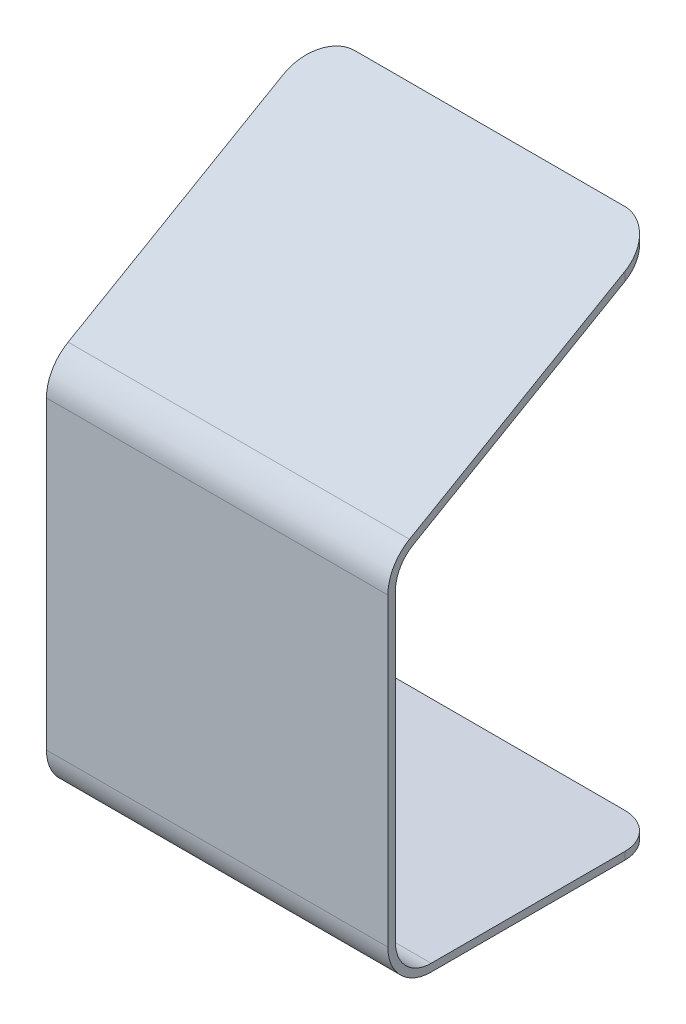
ISO-10303-21;
HEADER;
FILE_DESCRIPTION(('STEP AP214'),'2;1');
FILE_NAME('part.step','',(''),(''),'','','');
FILE_SCHEMA(('AUTOMOTIVE_DESIGN { 1 0 10303 214 1 1 1 1 }'));
ENDSEC;
DATA;
#1=APPLICATION_CONTEXT('core data for automotive mechanical design processes');
#2=APPLICATION_PROTOCOL_DEFINITION('international standard','automotive_design',2000,#1);
#3=PRODUCT_CONTEXT('',#1,'mechanical');
#4=PRODUCT('Part','Part','',(#3));
#5=PRODUCT_RELATED_PRODUCT_CATEGORY('part','',(#4));
#6=PRODUCT_DEFINITION_FORMATION('','',#4);
#7=PRODUCT_DEFINITION_CONTEXT('part definition',#1,'design');
#8=PRODUCT_DEFINITION('design','',#6,#7);
#9=PRODUCT_DEFINITION_SHAPE('','',#8);
#10=(LENGTH_UNIT() NAMED_UNIT(*) SI_UNIT(.MILLI.,.METRE.));
#11=(NAMED_UNIT(*) PLANE_ANGLE_UNIT() SI_UNIT($,.RADIAN.));
#12=(NAMED_UNIT(*) SI_UNIT($,.STERADIAN.) SOLID_ANGLE_UNIT());
#13=UNCERTAINTY_MEASURE_WITH_UNIT(LENGTH_MEASURE(1.E-05),#10,'distance_accuracy_value','');
#14=(GEOMETRIC_REPRESENTATION_CONTEXT(3) GLOBAL_UNCERTAINTY_ASSIGNED_CONTEXT((#13)) GLOBAL_UNIT_ASSIGNED_CONTEXT((#10,
#11,#12)) REPRESENTATION_CONTEXT('',''));
#15=CARTESIAN_POINT('',(0.,0.,0.));
#16=DIRECTION('',(0.,0.,1.));
#17=DIRECTION('',(1.,0.,0.));
#18=AXIS2_PLACEMENT_3D('',#15,#16,#17);
#19=CARTESIAN_POINT('',(61.5,105.01,8.5));
#20=DIRECTION('',(0.,-1.,0.));
#21=DIRECTION('',(0.,0.,-1.));
#22=AXIS2_PLACEMENT_3D('',#19,#20,#21);
#23=CYLINDRICAL_SURFACE('',#22,7.);
#24=DIRECTION('',(0.,-1.,0.));
#25=VECTOR('',#24,1.);
#26=CARTESIAN_POINT('',(61.5,105.01,1.5));
#27=LINE('',#26,#25);
#28=CARTESIAN_POINT('',(61.5,1.5,1.5));
#29=VERTEX_POINT('',#28);
#30=CARTESIAN_POINT('',(61.5,0.,1.5));
#31=VERTEX_POINT('',#30);
#32=EDGE_CURVE('E282',#29,#31,#27,.T.);
#33=ORIENTED_EDGE('',*,*,#32,.F.);
#34=CARTESIAN_POINT('',(61.5,1.5,8.5));
#35=DIRECTION('',(0.,1.,0.));
#36=DIRECTION('',(0.,0.,1.));
#37=AXIS2_PLACEMENT_3D('',#34,#35,#36);
#38=CIRCLE('',#37,7.);
#39=CARTESIAN_POINT('',(68.5,1.5,8.5));
#40=VERTEX_POINT('',#39);
#41=EDGE_CURVE('E195',#29,#40,#38,.F.);
#42=ORIENTED_EDGE('',*,*,#41,.T.);
#43=DIRECTION('',(0.,-1.,0.));
#44=VECTOR('',#43,1.);
#45=CARTESIAN_POINT('',(68.5,105.01,8.5));
#46=LINE('',#45,#44);
#47=CARTESIAN_POINT('',(68.5,0.,8.5));
#48=VERTEX_POINT('',#47);
#49=EDGE_CURVE('E279',#40,#48,#46,.T.);
#50=ORIENTED_EDGE('',*,*,#49,.T.);
#51=CARTESIAN_POINT('',(61.5,0.,8.5));
#52=DIRECTION('',(0.,1.,0.));
#53=DIRECTION('',(0.,0.,1.));
#54=AXIS2_PLACEMENT_3D('',#51,#52,#53);
#55=CIRCLE('',#54,7.);
#56=EDGE_CURVE('E242',#48,#31,#55,.T.);
#57=ORIENTED_EDGE('',*,*,#56,.T.);
#58=EDGE_LOOP('',(#33,#42,#50,#57));
#59=FACE_BOUND('',#58,.T.);
#60=ADVANCED_FACE('F32',(#59),#23,.T.);
#61=CARTESIAN_POINT('',(61.5,104.133974596216,1.5));
#62=VERTEX_POINT('',#61);
#63=CARTESIAN_POINT('',(61.5,102.401923788647,1.5));
#64=VERTEX_POINT('',#63);
#65=EDGE_CURVE('E281',#62,#64,#27,.T.);
#66=ORIENTED_EDGE('',*,*,#65,.F.);
#67=CARTESIAN_POINT('',(61.5,100.092522711888,8.5));
#68=DIRECTION('',(0.,-0.866025403784436,-0.500000000000004));
#69=DIRECTION('',(0.,-0.500000000000004,0.866025403784436));
#70=AXIS2_PLACEMENT_3D('',#67,#68,#69);
#71=ELLIPSE('',#70,8.08290376865478,7.);
#72=CARTESIAN_POINT('',(68.5,100.092522711888,8.5));
#73=VERTEX_POINT('',#72);
#74=EDGE_CURVE('E228',#62,#73,#71,.T.);
#75=ORIENTED_EDGE('',*,*,#74,.T.);
#76=CARTESIAN_POINT('',(68.5,98.3604719043192,8.5));
#77=VERTEX_POINT('',#76);
#78=EDGE_CURVE('E175',#73,#77,#46,.T.);
#79=ORIENTED_EDGE('',*,*,#78,.T.);
#80=CARTESIAN_POINT('',(61.5,98.3604719043192,8.5));
#81=DIRECTION('',(0.,-0.866025403784436,-0.500000000000004));
#82=DIRECTION('',(0.,-0.500000000000004,0.866025403784436));
#83=AXIS2_PLACEMENT_3D('',#80,#81,#82);
#84=ELLIPSE('',#83,8.08290376865478,7.);
#85=EDGE_CURVE('E201',#77,#64,#84,.F.);
#86=ORIENTED_EDGE('',*,*,#85,.T.);
#87=EDGE_LOOP('',(#66,#75,#79,#86));
#88=FACE_BOUND('',#87,.T.);
#89=ADVANCED_FACE('F351',(#88),#23,.T.);
#90=CARTESIAN_POINT('',(8.5,105.01,8.5));
#91=DIRECTION('',(0.,-1.,0.));
#92=DIRECTION('',(0.,0.,-1.));
#93=AXIS2_PLACEMENT_3D('',#90,#91,#92);
#94=CYLINDRICAL_SURFACE('',#93,7.);
#95=DIRECTION('',(0.,-1.,0.));
#96=VECTOR('',#95,1.);
#97=CARTESIAN_POINT('',(1.5,105.01,8.5));
#98=LINE('',#97,#96);
#99=CARTESIAN_POINT('',(1.5,1.5,8.5));
#100=VERTEX_POINT('',#99);
#101=CARTESIAN_POINT('',(1.5,0.,8.5));
#102=VERTEX_POINT('',#101);
#103=EDGE_CURVE('E11',#100,#102,#98,.T.);
#104=ORIENTED_EDGE('',*,*,#103,.F.);
#105=CARTESIAN_POINT('',(8.5,1.5,8.5));
#106=DIRECTION('',(0.,1.,0.));
#107=DIRECTION('',(0.,0.,1.));
#108=AXIS2_PLACEMENT_3D('',#105,#106,#107);
#109=CIRCLE('',#108,7.);
#110=CARTESIAN_POINT('',(8.5,1.5,1.5));
#111=VERTEX_POINT('',#110);
#112=EDGE_CURVE('E192',#100,#111,#109,.F.);
#113=ORIENTED_EDGE('',*,*,#112,.T.);
#114=DIRECTION('',(0.,-1.,0.));
#115=VECTOR('',#114,1.);
#116=CARTESIAN_POINT('',(8.5,105.01,1.5));
#117=LINE('',#116,#115);
#118=CARTESIAN_POINT('',(8.5,0.,1.5));
#119=VERTEX_POINT('',#118);
#120=EDGE_CURVE('E285',#111,#119,#117,.T.);
#121=ORIENTED_EDGE('',*,*,#120,.T.);
#122=CARTESIAN_POINT('',(8.5,0.,8.5));
#123=DIRECTION('',(0.,1.,0.));
#124=DIRECTION('',(0.,0.,1.));
#125=AXIS2_PLACEMENT_3D('',#122,#123,#124);
#126=CIRCLE('',#125,7.);
#127=EDGE_CURVE('E236',#119,#102,#126,.T.);
#128=ORIENTED_EDGE('',*,*,#127,.T.);
#129=EDGE_LOOP('',(#104,#113,#121,#128));
#130=FACE_BOUND('',#129,.T.);
#131=ADVANCED_FACE('F329',(#130),#94,.T.);
#132=CARTESIAN_POINT('',(1.5,100.092522711888,8.5));
#133=VERTEX_POINT('',#132);
#134=CARTESIAN_POINT('',(1.5,98.3604719043192,8.5));
#135=VERTEX_POINT('',#134);
#136=EDGE_CURVE('E41',#133,#135,#98,.T.);
#137=ORIENTED_EDGE('',*,*,#136,.F.);
#138=CARTESIAN_POINT('',(8.5,100.092522711888,8.5));
#139=DIRECTION('',(0.,-0.866025403784436,-0.500000000000004));
#140=DIRECTION('',(0.,-0.500000000000004,0.866025403784436));
#141=AXIS2_PLACEMENT_3D('',#138,#139,#140);
#142=ELLIPSE('',#141,8.08290376865478,7.);
#143=CARTESIAN_POINT('',(8.5,104.133974596216,1.5));
#144=VERTEX_POINT('',#143);
#145=EDGE_CURVE('E222',#133,#144,#142,.T.);
#146=ORIENTED_EDGE('',*,*,#145,.T.);
#147=CARTESIAN_POINT('',(8.5,102.401923788647,1.5));
#148=VERTEX_POINT('',#147);
#149=EDGE_CURVE('E284',#144,#148,#117,.T.);
#150=ORIENTED_EDGE('',*,*,#149,.T.);
#151=CARTESIAN_POINT('',(8.5,98.3604719043192,8.5));
#152=DIRECTION('',(0.,-0.866025403784436,-0.500000000000004));
#153=DIRECTION('',(0.,0.500000000000004,-0.866025403784436));
#154=AXIS2_PLACEMENT_3D('',#151,#152,#153);
#155=ELLIPSE('',#154,8.08290376865478,7.);
#156=EDGE_CURVE('E207',#148,#135,#155,.F.);
#157=ORIENTED_EDGE('',*,*,#156,.T.);
#158=EDGE_LOOP('',(#137,#146,#150,#157));
#159=FACE_BOUND('',#158,.T.);
#160=ADVANCED_FACE('F384',(#159),#94,.T.);
#161=CARTESIAN_POINT('',(1.5,105.01,66.7307479045185));
#162=DIRECTION('',(-1.,0.,0.));
#163=DIRECTION('',(0.,0.,1.));
#164=AXIS2_PLACEMENT_3D('',#161,#162,#163);
#165=PLANE('',#164);
#166=CARTESIAN_POINT('',(1.5,8.5,46.5));
#167=DIRECTION('',(-1.,0.,0.));
#168=DIRECTION('',(0.,0.,1.));
#169=AXIS2_PLACEMENT_3D('',#166,#167,#168);
#170=CIRCLE('',#169,8.5);
#171=CARTESIAN_POINT('',(1.5,8.49999999999999,55.));
#172=VERTEX_POINT('',#171);
#173=CARTESIAN_POINT('',(1.5,0.,46.5));
#174=VERTEX_POINT('',#173);
#175=EDGE_CURVE('E172',#172,#174,#170,.F.);
#176=ORIENTED_EDGE('',*,*,#175,.F.);
#177=DIRECTION('',(0.,1.,0.));
#178=VECTOR('',#177,1.);
#179=CARTESIAN_POINT('',(1.5,73.2457351945702,55.));
#180=LINE('',#179,#178);
#181=CARTESIAN_POINT('',(1.5,68.3382579064584,55.));
#182=VERTEX_POINT('',#181);
#183=EDGE_CURVE('E213',#172,#182,#180,.T.);
#184=ORIENTED_EDGE('',*,*,#183,.T.);
#185=CARTESIAN_POINT('',(1.5,68.3382579064584,46.5));
#186=DIRECTION('',(-1.,0.,0.));
#187=DIRECTION('',(0.,0.,1.));
#188=AXIS2_PLACEMENT_3D('',#185,#186,#187);
#189=CIRCLE('',#188,8.5);
#190=CARTESIAN_POINT('',(1.5,75.6994738386261,50.75));
#191=VERTEX_POINT('',#190);
#192=EDGE_CURVE('E253',#191,#182,#189,.F.);
#193=ORIENTED_EDGE('',*,*,#192,.F.);
#194=DIRECTION('',(0.,0.500000000000004,-0.866025403784436));
#195=VECTOR('',#194,1.);
#196=CARTESIAN_POINT('',(1.5,105.,0.));
#197=LINE('',#196,#195);
#198=EDGE_CURVE('E219',#191,#133,#197,.T.);
#199=ORIENTED_EDGE('',*,*,#198,.T.);
#200=ORIENTED_EDGE('',*,*,#136,.T.);
#201=DIRECTION('',(0.,-0.500000000000004,0.866025403784436));
#202=VECTOR('',#201,1.);
#203=CARTESIAN_POINT('',(1.5,103.700961894323,-0.750000000000007));
#204=LINE('',#203,#202);
#205=CARTESIAN_POINT('',(1.5,74.4004357329495,50.));
#206=VERTEX_POINT('',#205);
#207=EDGE_CURVE('E198',#135,#206,#204,.T.);
#208=ORIENTED_EDGE('',*,*,#207,.T.);
#209=CARTESIAN_POINT('',(1.5,68.3382579064584,46.5));
#210=DIRECTION('',(1.,0.,0.));
#211=DIRECTION('',(0.,0.,-1.));
#212=AXIS2_PLACEMENT_3D('',#209,#210,#211);
#213=CIRCLE('',#212,7.);
#214=CARTESIAN_POINT('',(1.5,68.3382579064584,53.5));
#215=VERTEX_POINT('',#214);
#216=EDGE_CURVE('E255',#215,#206,#213,.F.);
#217=ORIENTED_EDGE('',*,*,#216,.F.);
#218=DIRECTION('',(0.,-1.,0.));
#219=VECTOR('',#218,1.);
#220=CARTESIAN_POINT('',(1.5,73.2457351945702,53.5));
#221=LINE('',#220,#219);
#222=CARTESIAN_POINT('',(1.5,8.49999999999999,53.5));
#223=VERTEX_POINT('',#222);
#224=EDGE_CURVE('E210',#215,#223,#221,.T.);
#225=ORIENTED_EDGE('',*,*,#224,.T.);
#226=CARTESIAN_POINT('',(1.5,8.5,46.5));
#227=DIRECTION('',(1.,0.,0.));
#228=DIRECTION('',(0.,0.,-1.));
#229=AXIS2_PLACEMENT_3D('',#226,#227,#228);
#230=CIRCLE('',#229,7.);
#231=CARTESIAN_POINT('',(1.5,1.5,46.5));
#232=VERTEX_POINT('',#231);
#233=EDGE_CURVE('E258',#232,#223,#230,.F.);
#234=ORIENTED_EDGE('',*,*,#233,.F.);
#235=DIRECTION('',(0.,0.,-1.));
#236=VECTOR('',#235,1.);
#237=CARTESIAN_POINT('',(1.5,1.5,55.));
#238=LINE('',#237,#236);
#239=EDGE_CURVE('E189',#232,#100,#238,.T.);
#240=ORIENTED_EDGE('',*,*,#239,.T.);
#241=ORIENTED_EDGE('',*,*,#103,.T.);
#242=DIRECTION('',(0.,0.,1.));
#243=VECTOR('',#242,1.);
#244=CARTESIAN_POINT('',(1.5,0.,55.));
#245=LINE('',#244,#243);
#246=EDGE_CURVE('E234',#102,#174,#245,.T.);
#247=ORIENTED_EDGE('',*,*,#246,.T.);
#248=EDGE_LOOP('',(#176,#184,#193,#199,#200,#208,#217,#225,#234,#240,#241,#247));
#249=FACE_BOUND('',#248,.T.);
#250=ADVANCED_FACE('F332',(#249),#165,.T.);
#251=CARTESIAN_POINT('',(8.5,105.01,1.5));
#252=DIRECTION('',(0.,0.,-1.));
#253=DIRECTION('',(-1.,0.,0.));
#254=AXIS2_PLACEMENT_3D('',#251,#252,#253);
#255=PLANE('',#254);
#256=ORIENTED_EDGE('',*,*,#149,.F.);
#257=DIRECTION('',(1.,0.,0.));
#258=VECTOR('',#257,1.);
#259=CARTESIAN_POINT('',(70.,104.133974596216,1.5));
#260=LINE('',#259,#258);
#261=EDGE_CURVE('E225',#144,#62,#260,.T.);
#262=ORIENTED_EDGE('',*,*,#261,.T.);
#263=ORIENTED_EDGE('',*,*,#65,.T.);
#264=DIRECTION('',(-1.,0.,0.));
#265=VECTOR('',#264,1.);
#266=CARTESIAN_POINT('',(70.,102.401923788647,1.5));
#267=LINE('',#266,#265);
#268=EDGE_CURVE('E204',#64,#148,#267,.T.);
#269=ORIENTED_EDGE('',*,*,#268,.T.);
#270=EDGE_LOOP('',(#256,#262,#263,#269));
#271=FACE_BOUND('',#270,.T.);
#272=ADVANCED_FACE('F366',(#271),#255,.T.);
#273=DIRECTION('',(-1.,0.,0.));
#274=VECTOR('',#273,1.);
#275=CARTESIAN_POINT('',(70.,1.5,1.5));
#276=LINE('',#275,#274);
#277=EDGE_CURVE('E274',#29,#111,#276,.T.);
#278=ORIENTED_EDGE('',*,*,#277,.F.);
#279=ORIENTED_EDGE('',*,*,#32,.T.);
#280=DIRECTION('',(-1.,0.,0.));
#281=VECTOR('',#280,1.);
#282=CARTESIAN_POINT('',(70.,0.,1.5));
#283=LINE('',#282,#281);
#284=EDGE_CURVE('E239',#31,#119,#283,.T.);
#285=ORIENTED_EDGE('',*,*,#284,.T.);
#286=ORIENTED_EDGE('',*,*,#120,.F.);
#287=EDGE_LOOP('',(#278,#279,#285,#286));
#288=FACE_BOUND('',#287,.T.);
#289=ADVANCED_FACE('F325',(#288),#255,.T.);
#290=CARTESIAN_POINT('',(68.5,105.01,8.5));
#291=DIRECTION('',(1.,0.,0.));
#292=DIRECTION('',(0.,0.,-1.));
#293=AXIS2_PLACEMENT_3D('',#290,#291,#292);
#294=PLANE('',#293);
#295=CARTESIAN_POINT('',(68.5,8.5,46.5));
#296=DIRECTION('',(1.,0.,0.));
#297=DIRECTION('',(0.,0.,-1.));
#298=AXIS2_PLACEMENT_3D('',#295,#296,#297);
#299=CIRCLE('',#298,8.5);
#300=CARTESIAN_POINT('',(68.5,0.,46.5));
#301=VERTEX_POINT('',#300);
#302=CARTESIAN_POINT('',(68.5,8.49999999999999,55.));
#303=VERTEX_POINT('',#302);
#304=EDGE_CURVE('E248',#301,#303,#299,.F.);
#305=ORIENTED_EDGE('',*,*,#304,.F.);
#306=DIRECTION('',(0.,0.,-1.));
#307=VECTOR('',#306,1.);
#308=CARTESIAN_POINT('',(68.5,0.,55.));
#309=LINE('',#308,#307);
#310=EDGE_CURVE('E245',#301,#48,#309,.T.);
#311=ORIENTED_EDGE('',*,*,#310,.T.);
#312=ORIENTED_EDGE('',*,*,#49,.F.);
#313=DIRECTION('',(0.,0.,-1.));
#314=VECTOR('',#313,1.);
#315=CARTESIAN_POINT('',(68.5,1.5,55.));
#316=LINE('',#315,#314);
#317=CARTESIAN_POINT('',(68.5,1.5,46.5));
#318=VERTEX_POINT('',#317);
#319=EDGE_CURVE('E266',#318,#40,#316,.T.);
#320=ORIENTED_EDGE('',*,*,#319,.F.);
#321=CARTESIAN_POINT('',(68.5,8.5,46.5));
#322=DIRECTION('',(1.,0.,0.));
#323=DIRECTION('',(0.,0.,-1.));
#324=AXIS2_PLACEMENT_3D('',#321,#322,#323);
#325=CIRCLE('',#324,7.);
#326=CARTESIAN_POINT('',(68.5,8.49999999999999,53.5));
#327=VERTEX_POINT('',#326);
#328=EDGE_CURVE('E269',#327,#318,#325,.T.);
#329=ORIENTED_EDGE('',*,*,#328,.F.);
#330=DIRECTION('',(0.,-1.,0.));
#331=VECTOR('',#330,1.);
#332=CARTESIAN_POINT('',(68.5,73.2457351945702,53.5));
#333=LINE('',#332,#331);
#334=CARTESIAN_POINT('',(68.5,68.3382579064584,53.5));
#335=VERTEX_POINT('',#334);
#336=EDGE_CURVE('E271',#335,#327,#333,.T.);
#337=ORIENTED_EDGE('',*,*,#336,.F.);
#338=CARTESIAN_POINT('',(68.5,68.3382579064584,46.5));
#339=DIRECTION('',(1.,0.,0.));
#340=DIRECTION('',(0.,0.,-1.));
#341=AXIS2_PLACEMENT_3D('',#338,#339,#340);
#342=CIRCLE('',#341,7.);
#343=CARTESIAN_POINT('',(68.5,74.4004357329495,50.));
#344=VERTEX_POINT('',#343);
#345=EDGE_CURVE('E261',#344,#335,#342,.T.);
#346=ORIENTED_EDGE('',*,*,#345,.F.);
#347=DIRECTION('',(0.,-0.500000000000004,0.866025403784436));
#348=VECTOR('',#347,1.);
#349=CARTESIAN_POINT('',(68.5,103.700961894323,-0.750000000000007));
#350=LINE('',#349,#348);
#351=EDGE_CURVE('E264',#77,#344,#350,.T.);
#352=ORIENTED_EDGE('',*,*,#351,.F.);
#353=ORIENTED_EDGE('',*,*,#78,.F.);
#354=DIRECTION('',(0.,-0.500000000000004,0.866025403784436));
#355=VECTOR('',#354,1.);
#356=CARTESIAN_POINT('',(68.5,105.,0.));
#357=LINE('',#356,#355);
#358=CARTESIAN_POINT('',(68.5,75.6994738386261,50.75));
#359=VERTEX_POINT('',#358);
#360=EDGE_CURVE('E231',#73,#359,#357,.T.);
#361=ORIENTED_EDGE('',*,*,#360,.T.);
#362=CARTESIAN_POINT('',(68.5,68.3382579064584,46.5));
#363=DIRECTION('',(1.,0.,0.));
#364=DIRECTION('',(0.,0.,-1.));
#365=AXIS2_PLACEMENT_3D('',#362,#363,#364);
#366=CIRCLE('',#365,8.5);
#367=CARTESIAN_POINT('',(68.5,68.3382579064584,55.));
#368=VERTEX_POINT('',#367);
#369=EDGE_CURVE('E251',#368,#359,#366,.F.);
#370=ORIENTED_EDGE('',*,*,#369,.F.);
#371=DIRECTION('',(0.,-1.,0.));
#372=VECTOR('',#371,1.);
#373=CARTESIAN_POINT('',(68.5,73.2457351945702,55.));
#374=LINE('',#373,#372);
#375=EDGE_CURVE('E216',#368,#303,#374,.T.);
#376=ORIENTED_EDGE('',*,*,#375,.T.);
#377=EDGE_LOOP('',(#305,#311,#312,#320,#329,#337,#346,#352,#353,#361,#370,#376));
#378=FACE_BOUND('',#377,.T.);
#379=ADVANCED_FACE('F319',(#378),#294,.T.);
#380=CARTESIAN_POINT('',(70.,73.2457351945702,53.5));
#381=DIRECTION('',(0.,0.,-1.));
#382=DIRECTION('',(0.,1.,0.));
#383=AXIS2_PLACEMENT_3D('',#380,#381,#382);
#384=PLANE('',#383);
#385=ORIENTED_EDGE('',*,*,#224,.F.);
#386=DIRECTION('',(1.,0.,0.));
#387=VECTOR('',#386,1.);
#388=CARTESIAN_POINT('',(70.,68.3382579064584,53.5));
#389=LINE('',#388,#387);
#390=EDGE_CURVE('E273',#335,#215,#389,.F.);
#391=ORIENTED_EDGE('',*,*,#390,.F.);
#392=ORIENTED_EDGE('',*,*,#336,.T.);
#393=DIRECTION('',(1.,0.,0.));
#394=VECTOR('',#393,1.);
#395=CARTESIAN_POINT('',(70.,8.49999999999999,53.5));
#396=LINE('',#395,#394);
#397=EDGE_CURVE('E288',#223,#327,#396,.T.);
#398=ORIENTED_EDGE('',*,*,#397,.F.);
#399=EDGE_LOOP('',(#385,#391,#392,#398));
#400=FACE_BOUND('',#399,.T.);
#401=ADVANCED_FACE('F337',(#400),#384,.T.);
#402=CARTESIAN_POINT('',(70.,68.3382579064584,46.5));
#403=DIRECTION('',(-1.,0.,0.));
#404=DIRECTION('',(0.,0.,1.));
#405=AXIS2_PLACEMENT_3D('',#402,#403,#404);
#406=CYLINDRICAL_SURFACE('',#405,7.);
#407=ORIENTED_EDGE('',*,*,#345,.T.);
#408=ORIENTED_EDGE('',*,*,#390,.T.);
#409=ORIENTED_EDGE('',*,*,#216,.T.);
#410=DIRECTION('',(1.,0.,0.));
#411=VECTOR('',#410,1.);
#412=CARTESIAN_POINT('',(70.,74.4004357329495,50.));
#413=LINE('',#412,#411);
#414=EDGE_CURVE('E278',#206,#344,#413,.T.);
#415=ORIENTED_EDGE('',*,*,#414,.T.);
#416=EDGE_LOOP('',(#407,#408,#409,#415));
#417=FACE_BOUND('',#416,.T.);
#418=ADVANCED_FACE('F341',(#417),#406,.F.);
#419=CARTESIAN_POINT('',(70.,103.700961894323,-0.750000000000007));
#420=DIRECTION('',(0.,-0.866025403784436,-0.500000000000004));
#421=DIRECTION('',(0.,0.500000000000004,-0.866025403784436));
#422=AXIS2_PLACEMENT_3D('',#419,#420,#421);
#423=PLANE('',#422);
#424=ORIENTED_EDGE('',*,*,#207,.F.);
#425=ORIENTED_EDGE('',*,*,#156,.F.);
#426=ORIENTED_EDGE('',*,*,#268,.F.);
#427=ORIENTED_EDGE('',*,*,#85,.F.);
#428=ORIENTED_EDGE('',*,*,#351,.T.);
#429=ORIENTED_EDGE('',*,*,#414,.F.);
#430=EDGE_LOOP('',(#424,#425,#426,#427,#428,#429));
#431=FACE_BOUND('',#430,.T.);
#432=ADVANCED_FACE('F344',(#431),#423,.T.);
#433=CARTESIAN_POINT('',(70.,8.5,46.5));
#434=DIRECTION('',(-1.,0.,0.));
#435=DIRECTION('',(0.,0.,1.));
#436=AXIS2_PLACEMENT_3D('',#433,#434,#435);
#437=CYLINDRICAL_SURFACE('',#436,7.);
#438=DIRECTION('',(1.,0.,0.));
#439=VECTOR('',#438,1.);
#440=CARTESIAN_POINT('',(70.,1.5,46.5));
#441=LINE('',#440,#439);
#442=CARTESIAN_POINT('',(40.5312182202479,1.5,46.5));
#443=VERTEX_POINT('',#442);
#444=EDGE_CURVE('E188',#318,#443,#441,.F.);
#445=ORIENTED_EDGE('',*,*,#444,.T.);
#446=CARTESIAN_POINT('',(29.4687817797526,1.5,46.5));
#447=CARTESIAN_POINT('',(29.5301118335923,1.49997470016608,46.6459837601903));
#448=CARTESIAN_POINT('',(29.5972452807778,1.50456530663728,46.7894444680259));
#449=CARTESIAN_POINT('',(29.7423143634233,1.52184552435535,47.0700937770729));
#450=CARTESIAN_POINT('',(29.8202376857949,1.5345259623978,47.2072892939239));
#451=CARTESIAN_POINT('',(29.9856577824779,1.56674776836113,47.4736058736147));
#452=CARTESIAN_POINT('',(30.0730856098583,1.58624173405357,47.6027756413585));
#453=CARTESIAN_POINT('',(30.2571808960842,1.63088076856255,47.8532959998036));
#454=CARTESIAN_POINT('',(30.3538508368553,1.65602735782783,47.9746444754042));
#455=CARTESIAN_POINT('',(30.6558545126004,1.73787163193586,48.3250686648718));
#456=CARTESIAN_POINT('',(30.8740146998385,1.80115773839708,48.54185350332));
#457=CARTESIAN_POINT('',(31.2229674474469,1.90168119662235,48.8395003934864));
#458=CARTESIAN_POINT('',(31.3431093230496,1.93617991700726,48.9342545053146));
#459=CARTESIAN_POINT('',(31.5901522686312,2.00577702702049,49.1142612712932));
#460=CARTESIAN_POINT('',(31.7170539149063,2.04087546760342,49.1995131134169));
#461=CARTESIAN_POINT('',(32.1351595765042,2.1526002503018,49.4577152237021));
#462=CARTESIAN_POINT('',(32.4389860947111,2.22797020819354,49.6116423452689));
#463=CARTESIAN_POINT('',(32.9128385410771,2.32778322101689,49.8028641523064));
#464=CARTESIAN_POINT('',(33.073813805818,2.35884805320336,49.8599945192775));
#465=CARTESIAN_POINT('',(33.4009997373706,2.41493547074396,49.9605355692925));
#466=CARTESIAN_POINT('',(33.5672072671495,2.43996160147571,50.0039543072075));
#467=CARTESIAN_POINT('',(33.8984272186687,2.48182717388239,50.0753687476534));
#468=CARTESIAN_POINT('',(34.0633162361681,2.49889688149909,50.1038018533352));
#469=CARTESIAN_POINT('',(34.3955373788374,2.52494172459454,50.1468228286306));
#470=CARTESIAN_POINT('',(34.5628694107167,2.53391716834925,50.1614112255311));
#471=CARTESIAN_POINT('',(34.8983008123948,2.54319413130898,50.176485273935));
#472=CARTESIAN_POINT('',(35.0663996113153,2.54350129717984,50.1769801062315));
#473=CARTESIAN_POINT('',(35.4018257359008,2.53543544922339,50.1638816236283));
#474=CARTESIAN_POINT('',(35.5691531198947,2.52706310286008,50.1502893920393));
#475=CARTESIAN_POINT('',(35.8793963945288,2.50383350858317,50.1119814268931));
#476=CARTESIAN_POINT('',(36.022604177402,2.48998467190602,50.0889818653959));
#477=CARTESIAN_POINT('',(36.3063928030092,2.45681394525266,50.0328392799027));
#478=CARTESIAN_POINT('',(36.4469727776756,2.43749027963276,49.999692964743));
#479=CARTESIAN_POINT('',(36.8635555742569,2.37251772448071,49.8855156577538));
#480=CARTESIAN_POINT('',(37.134537826672,2.31985573719314,49.7897290694134));
#481=CARTESIAN_POINT('',(37.6778465761082,2.19939560639297,49.5530610745705));
#482=CARTESIAN_POINT('',(37.9487341433393,2.1307556416222,49.4093243070525));
#483=CARTESIAN_POINT('',(38.3360238570941,2.02630261857822,49.164423100178));
#484=CARTESIAN_POINT('',(38.4620563892969,1.99120237501183,49.0778113828557));
#485=CARTESIAN_POINT('',(38.7073301380954,1.9217649381766,48.8950726348188));
#486=CARTESIAN_POINT('',(38.8265699898637,1.8874278990948,48.7989437023959));
#487=CARTESIAN_POINT('',(39.0724626759913,1.81654405354974,48.584641852606));
#488=CARTESIAN_POINT('',(39.1981124144731,1.78027649997942,48.4652220969029));
#489=CARTESIAN_POINT('',(39.4391234457731,1.71218817937507,48.2153335092484));
#490=CARTESIAN_POINT('',(39.554489353178,1.68036541419327,48.0848696847809));
#491=CARTESIAN_POINT('',(39.7737425323597,1.62302659075819,47.8139110186491));
#492=CARTESIAN_POINT('',(39.8776596889457,1.59749388696536,47.6734439484195));
#493=CARTESIAN_POINT('',(40.0732683713339,1.55439329300806,47.3831968498862));
#494=CARTESIAN_POINT('',(40.164970083179,1.53681873709681,47.233424735528));
#495=CARTESIAN_POINT('',(40.3019835260846,1.51624075430047,46.9857799462951));
#496=CARTESIAN_POINT('',(40.3514467816795,1.51022792810372,46.8904280645694));
#497=CARTESIAN_POINT('',(40.4452326968096,1.5021057383745,46.6971011460833));
#498=CARTESIAN_POINT('',(40.4895567365325,1.49999532452375,46.5991268223465));
#499=CARTESIAN_POINT('',(40.5312182202479,1.5,46.5));
#500=B_SPLINE_CURVE_WITH_KNOTS('',3,(#446,#447,#448,#449,#450,#451,#452,#453,#454,#455,#456,
#457,#458,#459,#460,#461,#462,#463,#464,#465,#466,#467,#468,#469,#470,#471,#472,#473,#474,#475,
#476,#477,#478,#479,#480,#481,#482,#483,#484,#485,#486,#487,#488,#489,#490,#491,#492,#493,#494,
#495,#496,#497,#498,#499),.UNSPECIFIED.,.F.,.F.,(4,2,2,2,2,2,2,2,2,2,2,2,2,2,2,2,2,2,2,2,2,2,2,
2,2,2,4),(0.,0.474722070848745,0.948906800306641,1.4198561816956,1.89093239145707,
2.82839963876045,3.2986104326184,3.7688613780916,4.80938623269992,5.32968336813614,
5.84967428495937,6.35350403721282,6.85731459993119,7.36079696417146,7.86424061293848,
8.30085221223051,8.73760557957755,9.61070269904374,10.5496248981546,11.0199717318588,
11.490412739618,12.0210362307881,12.5514204078891,13.0803855644179,13.6089068363056,
13.9314576678152,14.2539216734492),.UNSPECIFIED.);
#501=CARTESIAN_POINT('',(29.4687817797526,1.5,46.5));
#502=VERTEX_POINT('',#501);
#503=EDGE_CURVE('E48',#502,#443,#500,.T.);
#504=ORIENTED_EDGE('',*,*,#503,.F.);
#505=EDGE_CURVE('E277',#502,#232,#441,.F.);
#506=ORIENTED_EDGE('',*,*,#505,.T.);
#507=ORIENTED_EDGE('',*,*,#233,.T.);
#508=ORIENTED_EDGE('',*,*,#397,.T.);
#509=ORIENTED_EDGE('',*,*,#328,.T.);
#510=EDGE_LOOP('',(#445,#504,#506,#507,#508,#509));
#511=FACE_BOUND('',#510,.T.);
#512=ADVANCED_FACE('F315',(#511),#437,.F.);
#513=CARTESIAN_POINT('',(70.,1.5,55.));
#514=DIRECTION('',(0.,1.,0.));
#515=DIRECTION('',(0.,0.,1.));
#516=AXIS2_PLACEMENT_3D('',#513,#514,#515);
#517=PLANE('',#516);
#518=CARTESIAN_POINT('',(35.0000000000003,1.5,44.1749999999999));
#519=DIRECTION('',(0.,1.,0.));
#520=DIRECTION('',(0.,0.,1.));
#521=AXIS2_PLACEMENT_3D('',#518,#519,#520);
#522=CIRCLE('',#521,6.);
#523=EDGE_CURVE('E161',#502,#443,#522,.F.);
#524=ORIENTED_EDGE('',*,*,#523,.T.);
#525=ORIENTED_EDGE('',*,*,#444,.F.);
#526=ORIENTED_EDGE('',*,*,#319,.T.);
#527=ORIENTED_EDGE('',*,*,#41,.F.);
#528=ORIENTED_EDGE('',*,*,#277,.T.);
#529=ORIENTED_EDGE('',*,*,#112,.F.);
#530=ORIENTED_EDGE('',*,*,#239,.F.);
#531=ORIENTED_EDGE('',*,*,#505,.F.);
#532=EDGE_LOOP('',(#524,#525,#526,#527,#528,#529,#530,#531));
#533=FACE_BOUND('',#532,.T.);
#534=ADVANCED_FACE('F312',(#533),#517,.T.);
#535=CARTESIAN_POINT('',(70.,105.,0.));
#536=DIRECTION('',(0.,-0.866025403784436,-0.500000000000004));
#537=DIRECTION('',(0.,0.500000000000004,-0.866025403784436));
#538=AXIS2_PLACEMENT_3D('',#535,#536,#537);
#539=PLANE('',#538);
#540=ORIENTED_EDGE('',*,*,#360,.F.);
#541=ORIENTED_EDGE('',*,*,#74,.F.);
#542=ORIENTED_EDGE('',*,*,#261,.F.);
#543=ORIENTED_EDGE('',*,*,#145,.F.);
#544=ORIENTED_EDGE('',*,*,#198,.F.);
#545=DIRECTION('',(-1.,0.,0.));
#546=VECTOR('',#545,1.);
#547=CARTESIAN_POINT('',(70.,75.6994738386261,50.75));
#548=LINE('',#547,#546);
#549=EDGE_CURVE('E183',#191,#359,#548,.F.);
#550=ORIENTED_EDGE('',*,*,#549,.T.);
#551=EDGE_LOOP('',(#540,#541,#542,#543,#544,#550));
#552=FACE_BOUND('',#551,.T.);
#553=ADVANCED_FACE('F34',(#552),#539,.F.);
#554=CARTESIAN_POINT('',(70.,73.2457351945702,55.));
#555=DIRECTION('',(0.,0.,-1.));
#556=DIRECTION('',(0.,1.,0.));
#557=AXIS2_PLACEMENT_3D('',#554,#555,#556);
#558=PLANE('',#557);
#559=ORIENTED_EDGE('',*,*,#375,.F.);
#560=DIRECTION('',(-1.,0.,0.));
#561=VECTOR('',#560,1.);
#562=CARTESIAN_POINT('',(70.,68.3382579064584,55.));
#563=LINE('',#562,#561);
#564=EDGE_CURVE('E174',#368,#182,#563,.T.);
#565=ORIENTED_EDGE('',*,*,#564,.T.);
#566=ORIENTED_EDGE('',*,*,#183,.F.);
#567=DIRECTION('',(-1.,0.,0.));
#568=VECTOR('',#567,1.);
#569=CARTESIAN_POINT('',(70.,8.49999999999999,55.));
#570=LINE('',#569,#568);
#571=EDGE_CURVE('E177',#172,#303,#570,.F.);
#572=ORIENTED_EDGE('',*,*,#571,.T.);
#573=EDGE_LOOP('',(#559,#565,#566,#572));
#574=FACE_BOUND('',#573,.T.);
#575=ADVANCED_FACE('F359',(#574),#558,.F.);
#576=CARTESIAN_POINT('',(70.,68.3382579064584,46.5));
#577=DIRECTION('',(-1.,0.,0.));
#578=DIRECTION('',(0.,0.,1.));
#579=AXIS2_PLACEMENT_3D('',#576,#577,#578);
#580=CYLINDRICAL_SURFACE('',#579,8.5);
#581=ORIENTED_EDGE('',*,*,#564,.F.);
#582=ORIENTED_EDGE('',*,*,#369,.T.);
#583=ORIENTED_EDGE('',*,*,#549,.F.);
#584=ORIENTED_EDGE('',*,*,#192,.T.);
#585=EDGE_LOOP('',(#581,#582,#583,#584));
#586=FACE_BOUND('',#585,.T.);
#587=ADVANCED_FACE('F358',(#586),#580,.T.);
#588=CARTESIAN_POINT('',(70.,0.,55.));
#589=DIRECTION('',(0.,1.,0.));
#590=DIRECTION('',(0.,0.,1.));
#591=AXIS2_PLACEMENT_3D('',#588,#589,#590);
#592=PLANE('',#591);
#593=DIRECTION('',(-1.,0.,0.));
#594=VECTOR('',#593,1.);
#595=CARTESIAN_POINT('',(70.,0.,46.5));
#596=LINE('',#595,#594);
#597=CARTESIAN_POINT('',(40.5312182202479,0.,46.5));
#598=VERTEX_POINT('',#597);
#599=EDGE_CURVE('E36',#301,#598,#596,.T.);
#600=ORIENTED_EDGE('',*,*,#599,.T.);
#601=CARTESIAN_POINT('',(35.0000000000003,0.,44.1749999999999));
#602=DIRECTION('',(0.,-1.,0.));
#603=DIRECTION('',(0.,0.,-1.));
#604=AXIS2_PLACEMENT_3D('',#601,#602,#603);
#605=CIRCLE('',#604,6.);
#606=CARTESIAN_POINT('',(29.4687817797526,0.,46.5));
#607=VERTEX_POINT('',#606);
#608=EDGE_CURVE('E55',#607,#598,#605,.T.);
#609=ORIENTED_EDGE('',*,*,#608,.F.);
#610=EDGE_CURVE('E166',#607,#174,#596,.T.);
#611=ORIENTED_EDGE('',*,*,#610,.T.);
#612=ORIENTED_EDGE('',*,*,#246,.F.);
#613=ORIENTED_EDGE('',*,*,#127,.F.);
#614=ORIENTED_EDGE('',*,*,#284,.F.);
#615=ORIENTED_EDGE('',*,*,#56,.F.);
#616=ORIENTED_EDGE('',*,*,#310,.F.);
#617=EDGE_LOOP('',(#600,#609,#611,#612,#613,#614,#615,#616));
#618=FACE_BOUND('',#617,.T.);
#619=ADVANCED_FACE('F164',(#618),#592,.F.);
#620=CARTESIAN_POINT('',(70.,8.5,46.5));
#621=DIRECTION('',(-1.,0.,0.));
#622=DIRECTION('',(0.,0.,1.));
#623=AXIS2_PLACEMENT_3D('',#620,#621,#622);
#624=CYLINDRICAL_SURFACE('',#623,8.5);
#625=CARTESIAN_POINT('',(29.4687817797526,0.,46.5));
#626=CARTESIAN_POINT('',(29.5313760879534,-2.43986574831991E-05,46.6489858062534));
#627=CARTESIAN_POINT('',(29.600018571255,0.00391589790983806,46.7953704714911));
#628=CARTESIAN_POINT('',(29.7486465047364,0.0187268491540125,47.0817503442479));
#629=CARTESIAN_POINT('',(29.8286223533929,0.0295916644164786,47.2217508290242));
#630=CARTESIAN_POINT('',(29.9988530510757,0.0571881075694948,47.4937612216967));
#631=CARTESIAN_POINT('',(30.089055579302,0.0738907091379191,47.6258069420354));
#632=CARTESIAN_POINT('',(30.2793435412272,0.11207995430463,47.8818647812101));
#633=CARTESIAN_POINT('',(30.3794309029934,0.133567532256954,48.0058753249172));
#634=CARTESIAN_POINT('',(30.5884310795294,0.1801151027378,48.244788131527));
#635=CARTESIAN_POINT('',(30.6973152642079,0.205163692948391,48.3597177112392));
#636=CARTESIAN_POINT('',(30.9235385334417,0.257739515506125,48.5803875805141));
#637=CARTESIAN_POINT('',(31.0408805243797,0.285267600708962,48.6861246834353));
#638=CARTESIAN_POINT('',(31.2835088921736,0.341671519587494,48.8880285151673));
#639=CARTESIAN_POINT('',(31.4088062219339,0.370549196292128,48.9841815594848));
#640=CARTESIAN_POINT('',(31.6665697138007,0.428448838530285,49.1663072838767));
#641=CARTESIAN_POINT('',(31.799036321831,0.457470812936827,49.2522793296376));
#642=CARTESIAN_POINT('',(32.0807185668226,0.516644615311489,49.4196749622288));
#643=CARTESIAN_POINT('',(32.2304445611676,0.546717220998335,49.5002699684744));
#644=CARTESIAN_POINT('',(32.5365505692893,0.604265152994504,49.6486031227349));
#645=CARTESIAN_POINT('',(32.6929281217258,0.631741428130717,49.7163459767505));
#646=CARTESIAN_POINT('',(33.0113660192919,0.682756775905788,49.838425827638));
#647=CARTESIAN_POINT('',(33.1734232289323,0.706297980764339,49.892770092174));
#648=CARTESIAN_POINT('',(33.5022029354214,0.748251174334396,49.9875611520608));
#649=CARTESIAN_POINT('',(33.6689251035965,0.766663523407328,50.0280089238476));
#650=CARTESIAN_POINT('',(34.000444521756,0.796877962812749,50.0934901986403));
#651=CARTESIAN_POINT('',(34.1651359296061,0.808870669986813,50.1189706827628));
#652=CARTESIAN_POINT('',(34.4964102243519,0.826475221574015,50.1561515934323));
#653=CARTESIAN_POINT('',(34.6629930690223,0.832087208151765,50.1678523269972));
#654=CARTESIAN_POINT('',(34.9965907559196,0.836622258973002,50.177318235787));
#655=CARTESIAN_POINT('',(35.1636054379859,0.835547523295173,50.1750879946081));
#656=CARTESIAN_POINT('',(35.4966872357469,0.826772938435146,50.1567321336191));
#657=CARTESIAN_POINT('',(35.6627543927812,0.819073380546603,50.1406071247623));
#658=CARTESIAN_POINT('',(35.9790385583825,0.79835716072887,50.0965582593061));
#659=CARTESIAN_POINT('',(36.1294391571507,0.785827976150905,50.0697096808206));
#660=CARTESIAN_POINT('',(36.4273628067069,0.756095315199998,50.0047418509847));
#661=CARTESIAN_POINT('',(36.5748848611879,0.738890250148284,49.9666187686161));
#662=CARTESIAN_POINT('',(36.8661188727191,0.700537644456004,49.879445484177));
#663=CARTESIAN_POINT('',(37.0098312640238,0.679390555383808,49.8303965335658));
#664=CARTESIAN_POINT('',(37.2927270969383,0.634009061032104,49.7217457422431));
#665=CARTESIAN_POINT('',(37.4319088434919,0.609773516558878,49.6621400044242));
#666=CARTESIAN_POINT('',(37.856636773663,0.531038134751911,49.4609427122368));
#667=CARTESIAN_POINT('',(38.133353145306,0.472777834362927,49.301727877188));
#668=CARTESIAN_POINT('',(38.6583281544623,0.355948431943942,48.9413538103964));
#669=CARTESIAN_POINT('',(38.9065557421739,0.297379064409037,48.7401494748843));
#670=CARTESIAN_POINT('',(39.2621408945084,0.214529011656032,48.4015515963804));
#671=CARTESIAN_POINT('',(39.3816618874239,0.186893858290052,48.2775347131285));
#672=CARTESIAN_POINT('',(39.6099596319155,0.135831841737787,48.0192094303731));
#673=CARTESIAN_POINT('',(39.7187412349431,0.112403074391306,47.8849057270204));
#674=CARTESIAN_POINT('',(39.9244074764358,0.0712535047901034,47.6072006195406));
#675=CARTESIAN_POINT('',(40.0213217718039,0.0535182862685146,47.4638233111455));
#676=CARTESIAN_POINT('',(40.2026106279544,0.0250580150881892,47.1687881167755));
#677=CARTESIAN_POINT('',(40.2869958132356,0.0143269964401634,47.0171373975058));
#678=CARTESIAN_POINT('',(40.3944369638748,0.00518070745624148,46.8026361837267));
#679=CARTESIAN_POINT('',(40.4232054630613,0.00325186794014253,46.742734794254));
#680=CARTESIAN_POINT('',(40.4787251517681,0.000662008095963149,46.6220342809124));
#681=CARTESIAN_POINT('',(40.5054779000833,-1.75049711152572E-09,46.5612358951256));
#682=CARTESIAN_POINT('',(40.5312182202479,0.,46.5));
#683=B_SPLINE_CURVE_WITH_KNOTS('',3,(#625,#626,#627,#628,#629,#630,#631,#632,#633,#634,#635,
#636,#637,#638,#639,#640,#641,#642,#643,#644,#645,#646,#647,#648,#649,#650,#651,#652,#653,#654,
#655,#656,#657,#658,#659,#660,#661,#662,#663,#664,#665,#666,#667,#668,#669,#670,#671,#672,#673,
#674,#675,#676,#677,#678,#679,#680,#681,#682),.UNSPECIFIED.,.F.,.F.,(4,2,2,2,2,2,2,2,2,2,2,2,2,
2,2,2,2,2,2,2,2,2,2,2,2,2,2,2,4),(0.,0.484541405290136,0.968674738754176,1.45043435383475,
1.93228812389849,2.41263237248564,2.89314247753317,3.3743291304162,3.85554574723001,
4.37295979473183,4.89018401641511,5.4071270649933,5.92403378317801,6.42459500199365,
6.92514506791755,7.42553045057247,7.92589383238964,8.38525000401904,8.84476244219699,
9.30422227442674,9.76385207414983,10.733129165754,11.703452832652,12.2261919963043,
12.7486939247864,13.2698622297029,13.7905860361379,13.9899857512329,14.1892296518925),.UNSPECIFIED.);
#684=EDGE_CURVE('E155',#607,#598,#683,.T.);
#685=ORIENTED_EDGE('',*,*,#684,.T.);
#686=ORIENTED_EDGE('',*,*,#599,.F.);
#687=ORIENTED_EDGE('',*,*,#304,.T.);
#688=ORIENTED_EDGE('',*,*,#571,.F.);
#689=ORIENTED_EDGE('',*,*,#175,.T.);
#690=ORIENTED_EDGE('',*,*,#610,.F.);
#691=EDGE_LOOP('',(#685,#686,#687,#688,#689,#690));
#692=FACE_BOUND('',#691,.T.);
#693=ADVANCED_FACE('F170',(#692),#624,.T.);
#694=CARTESIAN_POINT('',(35.0000000000003,104.134974596216,44.1749999999999));
#695=DIRECTION('',(0.,-1.,0.));
#696=DIRECTION('',(0.,0.,-1.));
#697=AXIS2_PLACEMENT_3D('',#694,#695,#696);
#698=CYLINDRICAL_SURFACE('',#697,6.);
#699=ORIENTED_EDGE('',*,*,#608,.T.);
#700=ORIENTED_EDGE('',*,*,#684,.F.);
#701=EDGE_LOOP('',(#699,#700));
#702=FACE_BOUND('',#701,.T.);
#703=ORIENTED_EDGE('',*,*,#503,.T.);
#704=ORIENTED_EDGE('',*,*,#523,.F.);
#705=EDGE_LOOP('',(#703,#704));
#706=FACE_BOUND('',#705,.T.);
#707=ADVANCED_FACE('F156',(#702,#706),#698,.F.);
#708=CLOSED_SHELL('',(#60,#89,#131,#160,#250,#272,#289,#379,#401,#418,#432,#512,#534,#553,#575,
#587,#619,#693,#707));
#709=MANIFOLD_SOLID_BREP('B2',#708);
#710=ADVANCED_BREP_SHAPE_REPRESENTATION('',(#18,#709),#14);
#711=SHAPE_DEFINITION_REPRESENTATION(#9,#710);
ENDSEC;
END-ISO-10303-21;
